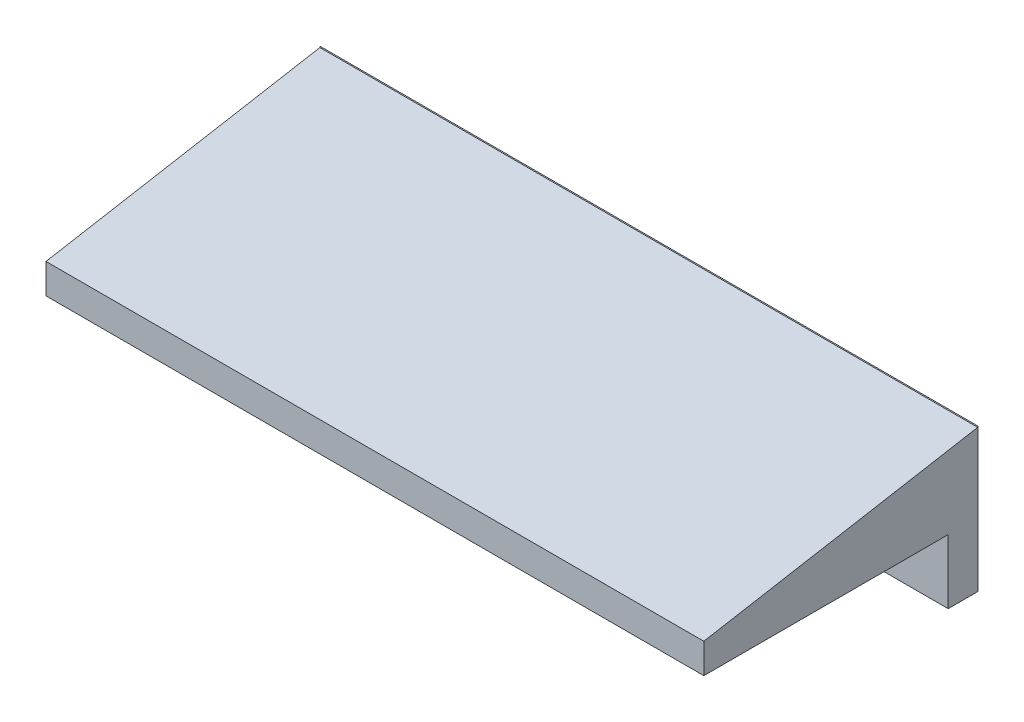
ISO-10303-21;
HEADER;
FILE_DESCRIPTION(('STEP AP214'),'2;1');
FILE_NAME('part.step','',(''),(''),'','','');
FILE_SCHEMA(('AUTOMOTIVE_DESIGN { 1 0 10303 214 1 1 1 1 }'));
ENDSEC;
DATA;
#1=APPLICATION_CONTEXT('core data for automotive mechanical design processes');
#2=APPLICATION_PROTOCOL_DEFINITION('international standard','automotive_design',2000,#1);
#3=PRODUCT_CONTEXT('',#1,'mechanical');
#4=PRODUCT('Part','Part','',(#3));
#5=PRODUCT_RELATED_PRODUCT_CATEGORY('part','',(#4));
#6=PRODUCT_DEFINITION_FORMATION('','',#4);
#7=PRODUCT_DEFINITION_CONTEXT('part definition',#1,'design');
#8=PRODUCT_DEFINITION('design','',#6,#7);
#9=PRODUCT_DEFINITION_SHAPE('','',#8);
#10=(LENGTH_UNIT() NAMED_UNIT(*) SI_UNIT(.MILLI.,.METRE.));
#11=(NAMED_UNIT(*) PLANE_ANGLE_UNIT() SI_UNIT($,.RADIAN.));
#12=(NAMED_UNIT(*) SI_UNIT($,.STERADIAN.) SOLID_ANGLE_UNIT());
#13=UNCERTAINTY_MEASURE_WITH_UNIT(LENGTH_MEASURE(1.E-05),#10,'distance_accuracy_value','');
#14=(GEOMETRIC_REPRESENTATION_CONTEXT(3) GLOBAL_UNCERTAINTY_ASSIGNED_CONTEXT((#13)) GLOBAL_UNIT_ASSIGNED_CONTEXT((#10,
#11,#12)) REPRESENTATION_CONTEXT('',''));
#15=CARTESIAN_POINT('',(0.,0.,0.));
#16=DIRECTION('',(0.,0.,1.));
#17=DIRECTION('',(1.,0.,0.));
#18=AXIS2_PLACEMENT_3D('',#15,#16,#17);
#19=CARTESIAN_POINT('',(-35.,-6.82499999999999,-16.175));
#20=DIRECTION('',(0.,1.,0.));
#21=DIRECTION('',(-1.,0.,0.));
#22=AXIS2_PLACEMENT_3D('',#19,#20,#21);
#23=PLANE('',#22);
#24=DIRECTION('',(-1.,0.,0.));
#25=VECTOR('',#24,1.);
#26=CARTESIAN_POINT('',(-35.,-6.82499999999999,-13.));
#27=LINE('',#26,#25);
#28=CARTESIAN_POINT('',(35.,-6.825,-13.));
#29=VERTEX_POINT('',#28);
#30=CARTESIAN_POINT('',(25.,-6.825,-13.));
#31=VERTEX_POINT('',#30);
#32=EDGE_CURVE('E125',#29,#31,#27,.T.);
#33=ORIENTED_EDGE('',*,*,#32,.T.);
#34=DIRECTION('',(0.,0.,-1.));
#35=VECTOR('',#34,1.);
#36=CARTESIAN_POINT('',(25.,-6.825,-6.175));
#37=LINE('',#36,#35);
#38=CARTESIAN_POINT('',(25.,-6.825,-16.175));
#39=VERTEX_POINT('',#38);
#40=EDGE_CURVE('E121',#31,#39,#37,.T.);
#41=ORIENTED_EDGE('',*,*,#40,.T.);
#42=DIRECTION('',(-1.,0.,0.));
#43=VECTOR('',#42,1.);
#44=CARTESIAN_POINT('',(-35.,-6.82499999999999,-16.175));
#45=LINE('',#44,#43);
#46=CARTESIAN_POINT('',(35.,-6.825,-16.175));
#47=VERTEX_POINT('',#46);
#48=EDGE_CURVE('E137',#47,#39,#45,.T.);
#49=ORIENTED_EDGE('',*,*,#48,.F.);
#50=DIRECTION('',(0.,0.,1.));
#51=VECTOR('',#50,1.);
#52=CARTESIAN_POINT('',(35.,-6.825,-16.175));
#53=LINE('',#52,#51);
#54=EDGE_CURVE('E136',#47,#29,#53,.T.);
#55=ORIENTED_EDGE('',*,*,#54,.T.);
#56=EDGE_LOOP('',(#33,#41,#49,#55));
#57=FACE_BOUND('',#56,.T.);
#58=ADVANCED_FACE('F34',(#57),#23,.F.);
#59=CARTESIAN_POINT('',(0.,0.,-13.));
#60=DIRECTION('',(0.,0.,1.));
#61=DIRECTION('',(1.,0.,0.));
#62=AXIS2_PLACEMENT_3D('',#59,#60,#61);
#63=PLANE('',#62);
#64=DIRECTION('',(0.,1.,0.));
#65=VECTOR('',#64,1.);
#66=CARTESIAN_POINT('',(25.,0.,-13.));
#67=LINE('',#66,#65);
#68=CARTESIAN_POINT('',(25.,0.,-13.));
#69=VERTEX_POINT('',#68);
#70=EDGE_CURVE('E11',#31,#69,#67,.T.);
#71=ORIENTED_EDGE('',*,*,#70,.F.);
#72=ORIENTED_EDGE('',*,*,#32,.F.);
#73=DIRECTION('',(0.,-1.,0.));
#74=VECTOR('',#73,1.);
#75=CARTESIAN_POINT('',(35.,3.175,-13.));
#76=LINE('',#75,#74);
#77=CARTESIAN_POINT('',(35.,0.,-13.));
#78=VERTEX_POINT('',#77);
#79=EDGE_CURVE('E126',#78,#29,#76,.T.);
#80=ORIENTED_EDGE('',*,*,#79,.F.);
#81=DIRECTION('',(-1.,0.,0.));
#82=VECTOR('',#81,1.);
#83=CARTESIAN_POINT('',(-35.,0.,-13.));
#84=LINE('',#83,#82);
#85=EDGE_CURVE('E80',#78,#69,#84,.T.);
#86=ORIENTED_EDGE('',*,*,#85,.T.);
#87=EDGE_LOOP('',(#71,#72,#80,#86));
#88=FACE_BOUND('',#87,.T.);
#89=CARTESIAN_POINT('',(28.575,-3.825,-13.));
#90=DIRECTION('',(0.,0.,1.));
#91=DIRECTION('',(1.,0.,0.));
#92=AXIS2_PLACEMENT_3D('',#89,#90,#91);
#93=CIRCLE('',#92,1.59999999999994);
#94=CARTESIAN_POINT('',(30.1749999999999,-3.825,-13.));
#95=VERTEX_POINT('',#94);
#96=EDGE_CURVE('E200',#95,#95,#93,.T.);
#97=ORIENTED_EDGE('',*,*,#96,.F.);
#98=EDGE_LOOP('',(#97));
#99=FACE_BOUND('',#98,.T.);
#100=ADVANCED_FACE('F245',(#88,#99),#63,.T.);
#101=CARTESIAN_POINT('',(35.,3.175,13.));
#102=DIRECTION('',(-1.,0.,0.));
#103=DIRECTION('',(0.,0.,1.));
#104=AXIS2_PLACEMENT_3D('',#101,#102,#103);
#105=PLANE('',#104);
#106=DIRECTION('',(0.,0.,-1.));
#107=VECTOR('',#106,1.);
#108=CARTESIAN_POINT('',(35.,0.,13.));
#109=LINE('',#108,#107);
#110=CARTESIAN_POINT('',(35.,0.,13.));
#111=VERTEX_POINT('',#110);
#112=EDGE_CURVE('E94',#111,#78,#109,.T.);
#113=ORIENTED_EDGE('',*,*,#112,.T.);
#114=ORIENTED_EDGE('',*,*,#79,.T.);
#115=ORIENTED_EDGE('',*,*,#54,.F.);
#116=DIRECTION('',(0.,-1.,0.));
#117=VECTOR('',#116,1.);
#118=CARTESIAN_POINT('',(35.,3.175,-16.175));
#119=LINE('',#118,#117);
#120=CARTESIAN_POINT('',(35.,8.41281224100232,-16.175));
#121=VERTEX_POINT('',#120);
#122=EDGE_CURVE('E207',#121,#47,#119,.T.);
#123=ORIENTED_EDGE('',*,*,#122,.F.);
#124=DIRECTION('',(0.,-0.952140320589897,0.30566126661219));
#125=VECTOR('',#124,1.);
#126=CARTESIAN_POINT('',(35.,-3.9214502993643,-12.2153879246706));
#127=LINE('',#126,#125);
#128=CARTESIAN_POINT('',(35.,8.3137311317087,-16.1431924431629));
#129=VERTEX_POINT('',#128);
#130=EDGE_CURVE('E169',#121,#129,#127,.T.);
#131=ORIENTED_EDGE('',*,*,#130,.T.);
#132=DIRECTION('',(0.,0.173648177666931,-0.984807753012208));
#133=VECTOR('',#132,1.);
#134=CARTESIAN_POINT('',(35.,5.30239296711449,0.934954942421101));
#135=LINE('',#134,#133);
#136=CARTESIAN_POINT('',(35.,3.175,13.));
#137=VERTEX_POINT('',#136);
#138=EDGE_CURVE('E175',#137,#129,#135,.T.);
#139=ORIENTED_EDGE('',*,*,#138,.F.);
#140=DIRECTION('',(0.,-1.,0.));
#141=VECTOR('',#140,1.);
#142=CARTESIAN_POINT('',(35.,3.175,13.));
#143=LINE('',#142,#141);
#144=EDGE_CURVE('E89',#137,#111,#143,.T.);
#145=ORIENTED_EDGE('',*,*,#144,.T.);
#146=EDGE_LOOP('',(#113,#114,#115,#123,#131,#139,#145));
#147=FACE_BOUND('',#146,.T.);
#148=ADVANCED_FACE('F36',(#147),#105,.F.);
#149=CARTESIAN_POINT('',(-35.,3.175,13.));
#150=DIRECTION('',(1.,0.,0.));
#151=DIRECTION('',(0.,0.,-1.));
#152=AXIS2_PLACEMENT_3D('',#149,#150,#151);
#153=PLANE('',#152);
#154=DIRECTION('',(0.,0.,1.));
#155=VECTOR('',#154,1.);
#156=CARTESIAN_POINT('',(-35.,0.,13.));
#157=LINE('',#156,#155);
#158=CARTESIAN_POINT('',(-35.,0.,-13.));
#159=VERTEX_POINT('',#158);
#160=CARTESIAN_POINT('',(-35.,0.,13.));
#161=VERTEX_POINT('',#160);
#162=EDGE_CURVE('E71',#159,#161,#157,.T.);
#163=ORIENTED_EDGE('',*,*,#162,.T.);
#164=DIRECTION('',(0.,-1.,0.));
#165=VECTOR('',#164,1.);
#166=CARTESIAN_POINT('',(-35.,3.175,13.));
#167=LINE('',#166,#165);
#168=CARTESIAN_POINT('',(-35.,3.175,13.));
#169=VERTEX_POINT('',#168);
#170=EDGE_CURVE('E58',#169,#161,#167,.T.);
#171=ORIENTED_EDGE('',*,*,#170,.F.);
#172=DIRECTION('',(0.,0.173648177666931,-0.984807753012208));
#173=VECTOR('',#172,1.);
#174=CARTESIAN_POINT('',(-35.,5.30239296711449,0.934954942421101));
#175=LINE('',#174,#173);
#176=CARTESIAN_POINT('',(-35.,8.3137311317087,-16.1431924431629));
#177=VERTEX_POINT('',#176);
#178=EDGE_CURVE('E174',#169,#177,#175,.T.);
#179=ORIENTED_EDGE('',*,*,#178,.T.);
#180=DIRECTION('',(0.,-0.952140320589897,0.30566126661219));
#181=VECTOR('',#180,1.);
#182=CARTESIAN_POINT('',(-35.,-3.9214502993643,-12.2153879246706));
#183=LINE('',#182,#181);
#184=CARTESIAN_POINT('',(-35.,8.41281224100232,-16.175));
#185=VERTEX_POINT('',#184);
#186=EDGE_CURVE('E171',#185,#177,#183,.T.);
#187=ORIENTED_EDGE('',*,*,#186,.F.);
#188=DIRECTION('',(0.,1.,0.));
#189=VECTOR('',#188,1.);
#190=CARTESIAN_POINT('',(-35.,3.175,-16.175));
#191=LINE('',#190,#189);
#192=CARTESIAN_POINT('',(-35.,-6.82499999999999,-16.175));
#193=VERTEX_POINT('',#192);
#194=EDGE_CURVE('E129',#193,#185,#191,.T.);
#195=ORIENTED_EDGE('',*,*,#194,.F.);
#196=DIRECTION('',(0.,0.,1.));
#197=VECTOR('',#196,1.);
#198=CARTESIAN_POINT('',(-35.,-6.82499999999999,-16.175));
#199=LINE('',#198,#197);
#200=CARTESIAN_POINT('',(-35.,-6.82499999999999,-13.));
#201=VERTEX_POINT('',#200);
#202=EDGE_CURVE('E134',#193,#201,#199,.T.);
#203=ORIENTED_EDGE('',*,*,#202,.T.);
#204=DIRECTION('',(0.,1.,0.));
#205=VECTOR('',#204,1.);
#206=CARTESIAN_POINT('',(-35.,3.175,-13.));
#207=LINE('',#206,#205);
#208=EDGE_CURVE('E75',#201,#159,#207,.T.);
#209=ORIENTED_EDGE('',*,*,#208,.T.);
#210=EDGE_LOOP('',(#163,#171,#179,#187,#195,#203,#209));
#211=FACE_BOUND('',#210,.T.);
#212=ADVANCED_FACE('F72',(#211),#153,.F.);
#213=CARTESIAN_POINT('',(-35.,3.175,13.));
#214=DIRECTION('',(0.,0.,-1.));
#215=DIRECTION('',(-1.,0.,0.));
#216=AXIS2_PLACEMENT_3D('',#213,#214,#215);
#217=PLANE('',#216);
#218=DIRECTION('',(1.,0.,0.));
#219=VECTOR('',#218,1.);
#220=CARTESIAN_POINT('',(-35.,0.,13.));
#221=LINE('',#220,#219);
#222=EDGE_CURVE('E79',#161,#111,#221,.T.);
#223=ORIENTED_EDGE('',*,*,#222,.T.);
#224=ORIENTED_EDGE('',*,*,#144,.F.);
#225=DIRECTION('',(1.,0.,0.));
#226=VECTOR('',#225,1.);
#227=CARTESIAN_POINT('',(-35.,3.175,13.));
#228=LINE('',#227,#226);
#229=EDGE_CURVE('E87',#169,#137,#228,.T.);
#230=ORIENTED_EDGE('',*,*,#229,.F.);
#231=ORIENTED_EDGE('',*,*,#170,.T.);
#232=EDGE_LOOP('',(#223,#224,#230,#231));
#233=FACE_BOUND('',#232,.T.);
#234=ADVANCED_FACE('F83',(#233),#217,.F.);
#235=CARTESIAN_POINT('',(0.,0.,0.));
#236=DIRECTION('',(0.,-1.,0.));
#237=DIRECTION('',(0.,0.,-1.));
#238=AXIS2_PLACEMENT_3D('',#235,#236,#237);
#239=PLANE('',#238);
#240=CARTESIAN_POINT('',(-3.,0.,-13.));
#241=VERTEX_POINT('',#240);
#242=EDGE_CURVE('E140',#241,#159,#84,.T.);
#243=ORIENTED_EDGE('',*,*,#242,.F.);
#244=DIRECTION('',(0.,0.,-1.));
#245=VECTOR('',#244,1.);
#246=CARTESIAN_POINT('',(-3.,0.,-6.175));
#247=LINE('',#246,#245);
#248=CARTESIAN_POINT('',(-3.,0.,-16.175));
#249=VERTEX_POINT('',#248);
#250=EDGE_CURVE('E49',#241,#249,#247,.T.);
#251=ORIENTED_EDGE('',*,*,#250,.T.);
#252=DIRECTION('',(1.,0.,0.));
#253=VECTOR('',#252,1.);
#254=CARTESIAN_POINT('',(25.,0.,-16.175));
#255=LINE('',#254,#253);
#256=CARTESIAN_POINT('',(25.,0.,-16.175));
#257=VERTEX_POINT('',#256);
#258=EDGE_CURVE('E151',#249,#257,#255,.T.);
#259=ORIENTED_EDGE('',*,*,#258,.T.);
#260=DIRECTION('',(0.,0.,-1.));
#261=VECTOR('',#260,1.);
#262=CARTESIAN_POINT('',(25.,0.,-6.175));
#263=LINE('',#262,#261);
#264=EDGE_CURVE('E154',#69,#257,#263,.T.);
#265=ORIENTED_EDGE('',*,*,#264,.F.);
#266=ORIENTED_EDGE('',*,*,#85,.F.);
#267=ORIENTED_EDGE('',*,*,#112,.F.);
#268=ORIENTED_EDGE('',*,*,#222,.F.);
#269=ORIENTED_EDGE('',*,*,#162,.F.);
#270=EDGE_LOOP('',(#243,#251,#259,#265,#266,#267,#268,#269));
#271=FACE_BOUND('',#270,.T.);
#272=ADVANCED_FACE('F92',(#271),#239,.T.);
#273=CARTESIAN_POINT('',(-3.,-6.825,-16.175));
#274=VERTEX_POINT('',#273);
#275=EDGE_CURVE('E120',#274,#193,#45,.T.);
#276=ORIENTED_EDGE('',*,*,#275,.F.);
#277=DIRECTION('',(0.,0.,-1.));
#278=VECTOR('',#277,1.);
#279=CARTESIAN_POINT('',(-3.,-6.825,-6.175));
#280=LINE('',#279,#278);
#281=CARTESIAN_POINT('',(-3.,-6.825,-13.));
#282=VERTEX_POINT('',#281);
#283=EDGE_CURVE('E104',#282,#274,#280,.T.);
#284=ORIENTED_EDGE('',*,*,#283,.F.);
#285=EDGE_CURVE('E118',#282,#201,#27,.T.);
#286=ORIENTED_EDGE('',*,*,#285,.T.);
#287=ORIENTED_EDGE('',*,*,#202,.F.);
#288=EDGE_LOOP('',(#276,#284,#286,#287));
#289=FACE_BOUND('',#288,.T.);
#290=ADVANCED_FACE('F115',(#289),#23,.F.);
#291=CARTESIAN_POINT('',(0.,0.,-16.175));
#292=DIRECTION('',(0.,0.,1.));
#293=DIRECTION('',(1.,0.,0.));
#294=AXIS2_PLACEMENT_3D('',#291,#292,#293);
#295=PLANE('',#294);
#296=CARTESIAN_POINT('',(-28.575,-3.82500000000001,-16.175));
#297=DIRECTION('',(0.,0.,1.));
#298=DIRECTION('',(1.,0.,0.));
#299=AXIS2_PLACEMENT_3D('',#296,#297,#298);
#300=CIRCLE('',#299,1.59999999999994);
#301=CARTESIAN_POINT('',(-26.9750000000001,-3.82500000000001,-16.175));
#302=VERTEX_POINT('',#301);
#303=EDGE_CURVE('E188',#302,#302,#300,.T.);
#304=ORIENTED_EDGE('',*,*,#303,.T.);
#305=EDGE_LOOP('',(#304));
#306=FACE_BOUND('',#305,.T.);
#307=CARTESIAN_POINT('',(-14.914,-3.82500000000001,-16.175));
#308=DIRECTION('',(0.,0.,1.));
#309=DIRECTION('',(1.,0.,0.));
#310=AXIS2_PLACEMENT_3D('',#307,#308,#309);
#311=CIRCLE('',#310,1.59999999999995);
#312=CARTESIAN_POINT('',(-13.3140000000001,-3.82500000000001,-16.175));
#313=VERTEX_POINT('',#312);
#314=EDGE_CURVE('E197',#313,#313,#311,.T.);
#315=ORIENTED_EDGE('',*,*,#314,.T.);
#316=EDGE_LOOP('',(#315));
#317=FACE_BOUND('',#316,.T.);
#318=CARTESIAN_POINT('',(28.575,-3.825,-16.175));
#319=DIRECTION('',(0.,0.,1.));
#320=DIRECTION('',(1.,0.,0.));
#321=AXIS2_PLACEMENT_3D('',#318,#319,#320);
#322=CIRCLE('',#321,1.59999999999994);
#323=CARTESIAN_POINT('',(30.1749999999999,-3.825,-16.175));
#324=VERTEX_POINT('',#323);
#325=EDGE_CURVE('E185',#324,#324,#322,.T.);
#326=ORIENTED_EDGE('',*,*,#325,.T.);
#327=EDGE_LOOP('',(#326));
#328=FACE_BOUND('',#327,.T.);
#329=ORIENTED_EDGE('',*,*,#48,.T.);
#330=DIRECTION('',(0.,-1.,0.));
#331=VECTOR('',#330,1.);
#332=CARTESIAN_POINT('',(25.,-6.825,-16.175));
#333=LINE('',#332,#331);
#334=EDGE_CURVE('E158',#257,#39,#333,.T.);
#335=ORIENTED_EDGE('',*,*,#334,.F.);
#336=ORIENTED_EDGE('',*,*,#258,.F.);
#337=DIRECTION('',(0.,1.,0.));
#338=VECTOR('',#337,1.);
#339=CARTESIAN_POINT('',(-3.,-6.825,-16.175));
#340=LINE('',#339,#338);
#341=EDGE_CURVE('E156',#274,#249,#340,.T.);
#342=ORIENTED_EDGE('',*,*,#341,.F.);
#343=ORIENTED_EDGE('',*,*,#275,.T.);
#344=ORIENTED_EDGE('',*,*,#194,.T.);
#345=DIRECTION('',(1.,0.,0.));
#346=VECTOR('',#345,1.);
#347=CARTESIAN_POINT('',(-35.,8.41281224100232,-16.175));
#348=LINE('',#347,#346);
#349=EDGE_CURVE('E177',#185,#121,#348,.T.);
#350=ORIENTED_EDGE('',*,*,#349,.T.);
#351=ORIENTED_EDGE('',*,*,#122,.T.);
#352=EDGE_LOOP('',(#329,#335,#336,#342,#343,#344,#350,#351));
#353=FACE_BOUND('',#352,.T.);
#354=ADVANCED_FACE('F161',(#306,#317,#328,#353),#295,.F.);
#355=DIRECTION('',(0.,-1.,0.));
#356=VECTOR('',#355,1.);
#357=CARTESIAN_POINT('',(-3.,0.,-13.));
#358=LINE('',#357,#356);
#359=EDGE_CURVE('E42',#241,#282,#358,.T.);
#360=ORIENTED_EDGE('',*,*,#359,.F.);
#361=ORIENTED_EDGE('',*,*,#242,.T.);
#362=ORIENTED_EDGE('',*,*,#208,.F.);
#363=ORIENTED_EDGE('',*,*,#285,.F.);
#364=EDGE_LOOP('',(#360,#361,#362,#363));
#365=FACE_BOUND('',#364,.T.);
#366=CARTESIAN_POINT('',(-28.575,-3.82500000000001,-13.));
#367=DIRECTION('',(0.,0.,1.));
#368=DIRECTION('',(1.,0.,0.));
#369=AXIS2_PLACEMENT_3D('',#366,#367,#368);
#370=CIRCLE('',#369,1.59999999999994);
#371=CARTESIAN_POINT('',(-26.9750000000001,-3.82500000000001,-13.));
#372=VERTEX_POINT('',#371);
#373=EDGE_CURVE('E191',#372,#372,#370,.T.);
#374=ORIENTED_EDGE('',*,*,#373,.F.);
#375=EDGE_LOOP('',(#374));
#376=FACE_BOUND('',#375,.T.);
#377=CARTESIAN_POINT('',(-14.914,-3.82500000000001,-13.));
#378=DIRECTION('',(0.,0.,1.));
#379=DIRECTION('',(1.,0.,0.));
#380=AXIS2_PLACEMENT_3D('',#377,#378,#379);
#381=CIRCLE('',#380,1.59999999999995);
#382=CARTESIAN_POINT('',(-13.3140000000001,-3.82500000000001,-13.));
#383=VERTEX_POINT('',#382);
#384=EDGE_CURVE('E194',#383,#383,#381,.T.);
#385=ORIENTED_EDGE('',*,*,#384,.F.);
#386=EDGE_LOOP('',(#385));
#387=FACE_BOUND('',#386,.T.);
#388=ADVANCED_FACE('F123',(#365,#376,#387),#63,.T.);
#389=CARTESIAN_POINT('',(28.575,-3.825,-16.175));
#390=DIRECTION('',(0.,0.,1.));
#391=DIRECTION('',(1.,0.,0.));
#392=AXIS2_PLACEMENT_3D('',#389,#390,#391);
#393=CYLINDRICAL_SURFACE('',#392,1.59999999999994);
#394=ORIENTED_EDGE('',*,*,#325,.F.);
#395=EDGE_LOOP('',(#394));
#396=FACE_BOUND('',#395,.T.);
#397=ORIENTED_EDGE('',*,*,#96,.T.);
#398=EDGE_LOOP('',(#397));
#399=FACE_BOUND('',#398,.T.);
#400=ADVANCED_FACE('F251',(#396,#399),#393,.F.);
#401=CARTESIAN_POINT('',(-14.914,-3.82500000000001,-16.175));
#402=DIRECTION('',(0.,0.,1.));
#403=DIRECTION('',(1.,0.,0.));
#404=AXIS2_PLACEMENT_3D('',#401,#402,#403);
#405=CYLINDRICAL_SURFACE('',#404,1.59999999999995);
#406=ORIENTED_EDGE('',*,*,#314,.F.);
#407=EDGE_LOOP('',(#406));
#408=FACE_BOUND('',#407,.T.);
#409=ORIENTED_EDGE('',*,*,#384,.T.);
#410=EDGE_LOOP('',(#409));
#411=FACE_BOUND('',#410,.T.);
#412=ADVANCED_FACE('F253',(#408,#411),#405,.F.);
#413=CARTESIAN_POINT('',(-28.575,-3.82500000000001,-16.175));
#414=DIRECTION('',(0.,0.,1.));
#415=DIRECTION('',(1.,0.,0.));
#416=AXIS2_PLACEMENT_3D('',#413,#414,#415);
#417=CYLINDRICAL_SURFACE('',#416,1.59999999999994);
#418=ORIENTED_EDGE('',*,*,#303,.F.);
#419=EDGE_LOOP('',(#418));
#420=FACE_BOUND('',#419,.T.);
#421=ORIENTED_EDGE('',*,*,#373,.T.);
#422=EDGE_LOOP('',(#421));
#423=FACE_BOUND('',#422,.T.);
#424=ADVANCED_FACE('F260',(#420,#423),#417,.F.);
#425=CARTESIAN_POINT('',(-35.,5.30239296711449,0.934954942421101));
#426=DIRECTION('',(0.,-0.984807753012208,-0.173648177666931));
#427=DIRECTION('',(0.,0.173648177666931,-0.984807753012208));
#428=AXIS2_PLACEMENT_3D('',#425,#426,#427);
#429=PLANE('',#428);
#430=ORIENTED_EDGE('',*,*,#138,.T.);
#431=DIRECTION('',(1.,0.,0.));
#432=VECTOR('',#431,1.);
#433=CARTESIAN_POINT('',(-35.,8.3137311317087,-16.1431924431629));
#434=LINE('',#433,#432);
#435=EDGE_CURVE('E182',#177,#129,#434,.T.);
#436=ORIENTED_EDGE('',*,*,#435,.F.);
#437=ORIENTED_EDGE('',*,*,#178,.F.);
#438=ORIENTED_EDGE('',*,*,#229,.T.);
#439=EDGE_LOOP('',(#430,#436,#437,#438));
#440=FACE_BOUND('',#439,.T.);
#441=ADVANCED_FACE('F343',(#440),#429,.F.);
#442=CARTESIAN_POINT('',(-35.,-3.9214502993643,-12.2153879246706));
#443=DIRECTION('',(0.,0.30566126661219,0.952140320589897));
#444=DIRECTION('',(0.,-0.952140320589897,0.30566126661219));
#445=AXIS2_PLACEMENT_3D('',#442,#443,#444);
#446=PLANE('',#445);
#447=ORIENTED_EDGE('',*,*,#130,.F.);
#448=ORIENTED_EDGE('',*,*,#349,.F.);
#449=ORIENTED_EDGE('',*,*,#186,.T.);
#450=ORIENTED_EDGE('',*,*,#435,.T.);
#451=EDGE_LOOP('',(#447,#448,#449,#450));
#452=FACE_BOUND('',#451,.T.);
#453=ADVANCED_FACE('F224',(#452),#446,.T.);
#454=CARTESIAN_POINT('',(25.,-6.825,-6.175));
#455=DIRECTION('',(1.,0.,0.));
#456=DIRECTION('',(0.,0.,-1.));
#457=AXIS2_PLACEMENT_3D('',#454,#455,#456);
#458=PLANE('',#457);
#459=ORIENTED_EDGE('',*,*,#70,.T.);
#460=ORIENTED_EDGE('',*,*,#264,.T.);
#461=ORIENTED_EDGE('',*,*,#334,.T.);
#462=ORIENTED_EDGE('',*,*,#40,.F.);
#463=EDGE_LOOP('',(#459,#460,#461,#462));
#464=FACE_BOUND('',#463,.T.);
#465=ADVANCED_FACE('F243',(#464),#458,.F.);
#466=CARTESIAN_POINT('',(-3.,-6.825,-6.175));
#467=DIRECTION('',(-1.,0.,0.));
#468=DIRECTION('',(0.,0.,1.));
#469=AXIS2_PLACEMENT_3D('',#466,#467,#468);
#470=PLANE('',#469);
#471=ORIENTED_EDGE('',*,*,#359,.T.);
#472=ORIENTED_EDGE('',*,*,#283,.T.);
#473=ORIENTED_EDGE('',*,*,#341,.T.);
#474=ORIENTED_EDGE('',*,*,#250,.F.);
#475=EDGE_LOOP('',(#471,#472,#473,#474));
#476=FACE_BOUND('',#475,.T.);
#477=ADVANCED_FACE('F102',(#476),#470,.F.);
#478=CLOSED_SHELL('',(#58,#100,#148,#212,#234,#272,#290,#354,#388,#400,#412,#424,#441,#453,#465,#477));
#479=MANIFOLD_SOLID_BREP('B2',#478);
#480=ADVANCED_BREP_SHAPE_REPRESENTATION('',(#18,#479),#14);
#481=SHAPE_DEFINITION_REPRESENTATION(#9,#480);
ENDSEC;
END-ISO-10303-21;
